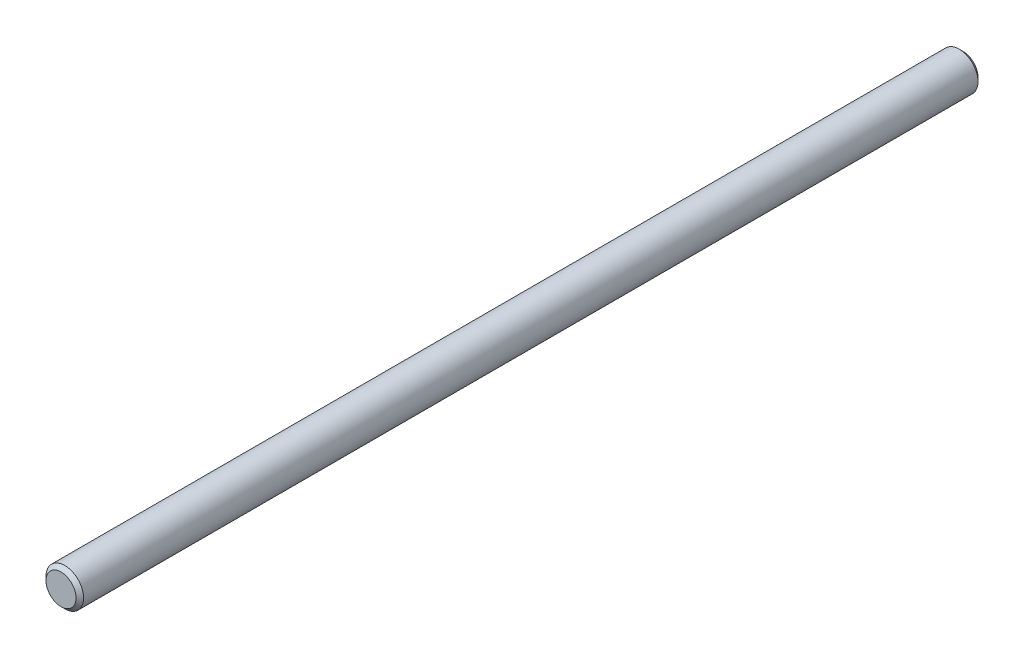
ISO-10303-21;
HEADER;
FILE_DESCRIPTION(('STEP AP214'),'2;1');
FILE_NAME('part.step','',(''),(''),'','','');
FILE_SCHEMA(('AUTOMOTIVE_DESIGN { 1 0 10303 214 1 1 1 1 }'));
ENDSEC;
DATA;
#1=APPLICATION_CONTEXT('core data for automotive mechanical design processes');
#2=APPLICATION_PROTOCOL_DEFINITION('international standard','automotive_design',2000,#1);
#3=PRODUCT_CONTEXT('',#1,'mechanical');
#4=PRODUCT('Part','Part','',(#3));
#5=PRODUCT_RELATED_PRODUCT_CATEGORY('part','',(#4));
#6=PRODUCT_DEFINITION_FORMATION('','',#4);
#7=PRODUCT_DEFINITION_CONTEXT('part definition',#1,'design');
#8=PRODUCT_DEFINITION('design','',#6,#7);
#9=PRODUCT_DEFINITION_SHAPE('','',#8);
#10=(LENGTH_UNIT() NAMED_UNIT(*) SI_UNIT(.MILLI.,.METRE.));
#11=(NAMED_UNIT(*) PLANE_ANGLE_UNIT() SI_UNIT($,.RADIAN.));
#12=(NAMED_UNIT(*) SI_UNIT($,.STERADIAN.) SOLID_ANGLE_UNIT());
#13=UNCERTAINTY_MEASURE_WITH_UNIT(LENGTH_MEASURE(1.E-05),#10,'distance_accuracy_value','');
#14=(GEOMETRIC_REPRESENTATION_CONTEXT(3) GLOBAL_UNCERTAINTY_ASSIGNED_CONTEXT((#13)) GLOBAL_UNIT_ASSIGNED_CONTEXT((#10,
#11,#12)) REPRESENTATION_CONTEXT('',''));
#15=CARTESIAN_POINT('',(0.,0.,0.));
#16=DIRECTION('',(0.,0.,1.));
#17=DIRECTION('',(1.,0.,0.));
#18=AXIS2_PLACEMENT_3D('',#15,#16,#17);
#19=CARTESIAN_POINT('',(0.,0.,60.));
#20=DIRECTION('',(0.,0.,-1.));
#21=DIRECTION('',(-1.,0.,0.));
#22=AXIS2_PLACEMENT_3D('',#19,#20,#21);
#23=CYLINDRICAL_SURFACE('',#22,2.5);
#24=CARTESIAN_POINT('',(0.,0.,-59.5));
#25=DIRECTION('',(0.,0.,1.));
#26=DIRECTION('',(1.,0.,0.));
#27=AXIS2_PLACEMENT_3D('',#24,#25,#26);
#28=CIRCLE('',#27,2.5);
#29=CARTESIAN_POINT('',(2.5,0.,-59.5));
#30=VERTEX_POINT('',#29);
#31=EDGE_CURVE('E42',#30,#30,#28,.T.);
#32=ORIENTED_EDGE('',*,*,#31,.T.);
#33=EDGE_LOOP('',(#32));
#34=FACE_BOUND('',#33,.T.);
#35=CARTESIAN_POINT('',(0.,0.,59.5));
#36=DIRECTION('',(0.,0.,1.));
#37=DIRECTION('',(1.,0.,0.));
#38=AXIS2_PLACEMENT_3D('',#35,#36,#37);
#39=CIRCLE('',#38,2.5);
#40=CARTESIAN_POINT('',(2.5,0.,59.5));
#41=VERTEX_POINT('',#40);
#42=EDGE_CURVE('E46',#41,#41,#39,.F.);
#43=ORIENTED_EDGE('',*,*,#42,.T.);
#44=EDGE_LOOP('',(#43));
#45=FACE_BOUND('',#44,.T.);
#46=ADVANCED_FACE('F31',(#34,#45),#23,.T.);
#47=CARTESIAN_POINT('',(0.,0.,60.));
#48=DIRECTION('',(0.,0.,1.));
#49=DIRECTION('',(1.,0.,0.));
#50=AXIS2_PLACEMENT_3D('',#47,#48,#49);
#51=PLANE('',#50);
#52=CARTESIAN_POINT('',(0.,0.,60.));
#53=DIRECTION('',(0.,0.,1.));
#54=DIRECTION('',(1.,0.,0.));
#55=AXIS2_PLACEMENT_3D('',#52,#53,#54);
#56=CIRCLE('',#55,2.00000000000002);
#57=CARTESIAN_POINT('',(2.00000000000002,0.,60.));
#58=VERTEX_POINT('',#57);
#59=EDGE_CURVE('E10',#58,#58,#56,.T.);
#60=ORIENTED_EDGE('',*,*,#59,.T.);
#61=EDGE_LOOP('',(#60));
#62=FACE_BOUND('',#61,.T.);
#63=ADVANCED_FACE('F62',(#62),#51,.T.);
#64=CARTESIAN_POINT('',(0.,0.,-60.));
#65=DIRECTION('',(0.,0.,1.));
#66=DIRECTION('',(1.,0.,0.));
#67=AXIS2_PLACEMENT_3D('',#64,#65,#66);
#68=PLANE('',#67);
#69=CARTESIAN_POINT('',(0.,0.,-60.));
#70=DIRECTION('',(0.,0.,1.));
#71=DIRECTION('',(1.,0.,0.));
#72=AXIS2_PLACEMENT_3D('',#69,#70,#71);
#73=CIRCLE('',#72,1.99999999999999);
#74=CARTESIAN_POINT('',(1.99999999999999,0.,-60.));
#75=VERTEX_POINT('',#74);
#76=EDGE_CURVE('E38',#75,#75,#73,.F.);
#77=ORIENTED_EDGE('',*,*,#76,.T.);
#78=EDGE_LOOP('',(#77));
#79=FACE_BOUND('',#78,.T.);
#80=ADVANCED_FACE('F59',(#79),#68,.F.);
#81=CARTESIAN_POINT('',(0.,0.,-59.5));
#82=DIRECTION('',(0.,0.,1.));
#83=DIRECTION('',(1.,0.,0.));
#84=AXIS2_PLACEMENT_3D('',#81,#82,#83);
#85=CONICAL_SURFACE('',#84,2.5,0.78539816339746);
#86=ORIENTED_EDGE('',*,*,#76,.F.);
#87=EDGE_LOOP('',(#86));
#88=FACE_BOUND('',#87,.T.);
#89=ORIENTED_EDGE('',*,*,#31,.F.);
#90=EDGE_LOOP('',(#89));
#91=FACE_BOUND('',#90,.T.);
#92=ADVANCED_FACE('F55',(#88,#91),#85,.T.);
#93=CARTESIAN_POINT('',(0.,0.,60.));
#94=DIRECTION('',(0.,0.,-1.));
#95=DIRECTION('',(-1.,0.,0.));
#96=AXIS2_PLACEMENT_3D('',#93,#94,#95);
#97=CONICAL_SURFACE('',#96,2.00000000000002,0.785398163397453);
#98=ORIENTED_EDGE('',*,*,#42,.F.);
#99=EDGE_LOOP('',(#98));
#100=FACE_BOUND('',#99,.T.);
#101=ORIENTED_EDGE('',*,*,#59,.F.);
#102=EDGE_LOOP('',(#101));
#103=FACE_BOUND('',#102,.T.);
#104=ADVANCED_FACE('F33',(#100,#103),#97,.T.);
#105=CLOSED_SHELL('',(#46,#63,#80,#92,#104));
#106=MANIFOLD_SOLID_BREP('B2',#105);
#107=ADVANCED_BREP_SHAPE_REPRESENTATION('',(#18,#106),#14);
#108=SHAPE_DEFINITION_REPRESENTATION(#9,#107);
ENDSEC;
END-ISO-10303-21;
